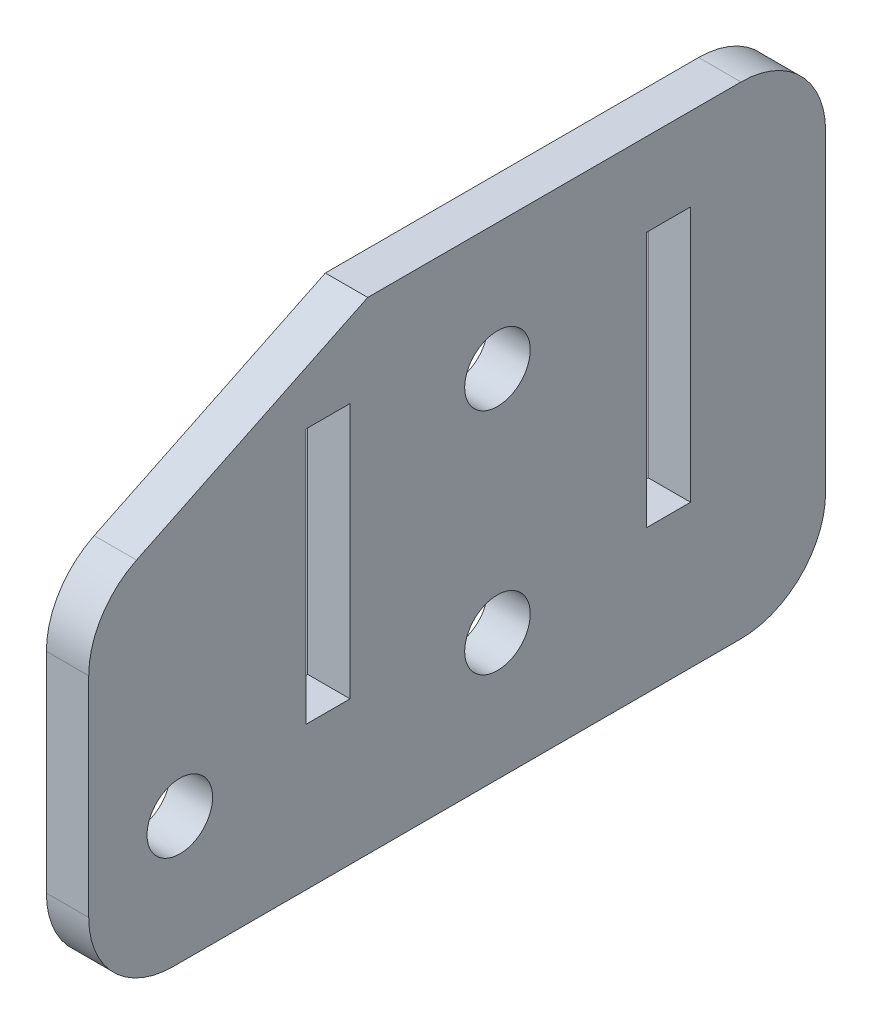
ISO-10303-21;
HEADER;
FILE_DESCRIPTION(('STEP AP214'),'2;1');
FILE_NAME('part.step','',(''),(''),'','','');
FILE_SCHEMA(('AUTOMOTIVE_DESIGN { 1 0 10303 214 1 1 1 1 }'));
ENDSEC;
DATA;
#1=APPLICATION_CONTEXT('core data for automotive mechanical design processes');
#2=APPLICATION_PROTOCOL_DEFINITION('international standard','automotive_design',2000,#1);
#3=PRODUCT_CONTEXT('',#1,'mechanical');
#4=PRODUCT('Part','Part','',(#3));
#5=PRODUCT_RELATED_PRODUCT_CATEGORY('part','',(#4));
#6=PRODUCT_DEFINITION_FORMATION('','',#4);
#7=PRODUCT_DEFINITION_CONTEXT('part definition',#1,'design');
#8=PRODUCT_DEFINITION('design','',#6,#7);
#9=PRODUCT_DEFINITION_SHAPE('','',#8);
#10=(LENGTH_UNIT() NAMED_UNIT(*) SI_UNIT(.MILLI.,.METRE.));
#11=(NAMED_UNIT(*) PLANE_ANGLE_UNIT() SI_UNIT($,.RADIAN.));
#12=(NAMED_UNIT(*) SI_UNIT($,.STERADIAN.) SOLID_ANGLE_UNIT());
#13=UNCERTAINTY_MEASURE_WITH_UNIT(LENGTH_MEASURE(1.E-05),#10,'distance_accuracy_value','');
#14=(GEOMETRIC_REPRESENTATION_CONTEXT(3) GLOBAL_UNCERTAINTY_ASSIGNED_CONTEXT((#13)) GLOBAL_UNIT_ASSIGNED_CONTEXT((#10,
#11,#12)) REPRESENTATION_CONTEXT('',''));
#15=CARTESIAN_POINT('',(0.,0.,0.));
#16=DIRECTION('',(0.,0.,1.));
#17=DIRECTION('',(1.,0.,0.));
#18=AXIS2_PLACEMENT_3D('',#15,#16,#17);
#19=CARTESIAN_POINT('',(3.175,0.,0.));
#20=DIRECTION('',(0.,1.,0.));
#21=DIRECTION('',(0.,0.,1.));
#22=AXIS2_PLACEMENT_3D('',#19,#20,#21);
#23=PLANE('',#22);
#24=DIRECTION('',(0.,0.,-1.));
#25=VECTOR('',#24,1.);
#26=CARTESIAN_POINT('',(3.175,0.,0.));
#27=LINE('',#26,#25);
#28=CARTESIAN_POINT('',(3.175,0.,-6.35));
#29=VERTEX_POINT('',#28);
#30=CARTESIAN_POINT('',(3.175,0.,-48.895));
#31=VERTEX_POINT('',#30);
#32=EDGE_CURVE('E271',#29,#31,#27,.T.);
#33=ORIENTED_EDGE('',*,*,#32,.F.);
#34=DIRECTION('',(-1.,0.,0.));
#35=VECTOR('',#34,1.);
#36=CARTESIAN_POINT('',(3.175,0.,-6.35));
#37=LINE('',#36,#35);
#38=CARTESIAN_POINT('',(0.,0.,-6.35));
#39=VERTEX_POINT('',#38);
#40=EDGE_CURVE('E346',#29,#39,#37,.T.);
#41=ORIENTED_EDGE('',*,*,#40,.T.);
#42=DIRECTION('',(0.,0.,-1.));
#43=VECTOR('',#42,1.);
#44=CARTESIAN_POINT('',(0.,0.,0.));
#45=LINE('',#44,#43);
#46=CARTESIAN_POINT('',(0.,0.,-48.895));
#47=VERTEX_POINT('',#46);
#48=EDGE_CURVE('E222',#39,#47,#45,.T.);
#49=ORIENTED_EDGE('',*,*,#48,.T.);
#50=DIRECTION('',(-1.,0.,0.));
#51=VECTOR('',#50,1.);
#52=CARTESIAN_POINT('',(3.175,0.,-48.895));
#53=LINE('',#52,#51);
#54=EDGE_CURVE('E343',#47,#31,#53,.F.);
#55=ORIENTED_EDGE('',*,*,#54,.T.);
#56=EDGE_LOOP('',(#33,#41,#49,#55));
#57=FACE_BOUND('',#56,.T.);
#58=ADVANCED_FACE('F47',(#57),#23,.F.);
#59=CARTESIAN_POINT('',(3.175,0.,-55.245));
#60=DIRECTION('',(0.,0.,1.));
#61=DIRECTION('',(1.,0.,0.));
#62=AXIS2_PLACEMENT_3D('',#59,#60,#61);
#63=PLANE('',#62);
#64=DIRECTION('',(0.,1.,0.));
#65=VECTOR('',#64,1.);
#66=CARTESIAN_POINT('',(0.,0.,-55.245));
#67=LINE('',#66,#65);
#68=CARTESIAN_POINT('',(0.,6.35,-55.245));
#69=VERTEX_POINT('',#68);
#70=CARTESIAN_POINT('',(0.,29.80436,-55.245));
#71=VERTEX_POINT('',#70);
#72=EDGE_CURVE('E294',#69,#71,#67,.T.);
#73=ORIENTED_EDGE('',*,*,#72,.T.);
#74=DIRECTION('',(-1.,0.,0.));
#75=VECTOR('',#74,1.);
#76=CARTESIAN_POINT('',(3.175,29.80436,-55.245));
#77=LINE('',#76,#75);
#78=CARTESIAN_POINT('',(3.175,29.80436,-55.245));
#79=VERTEX_POINT('',#78);
#80=EDGE_CURVE('E11',#71,#79,#77,.F.);
#81=ORIENTED_EDGE('',*,*,#80,.T.);
#82=DIRECTION('',(0.,1.,0.));
#83=VECTOR('',#82,1.);
#84=CARTESIAN_POINT('',(3.175,0.,-55.245));
#85=LINE('',#84,#83);
#86=CARTESIAN_POINT('',(3.175,6.35,-55.245));
#87=VERTEX_POINT('',#86);
#88=EDGE_CURVE('E275',#87,#79,#85,.T.);
#89=ORIENTED_EDGE('',*,*,#88,.F.);
#90=DIRECTION('',(-1.,0.,0.));
#91=VECTOR('',#90,1.);
#92=CARTESIAN_POINT('',(3.175,6.35,-55.245));
#93=LINE('',#92,#91);
#94=EDGE_CURVE('E57',#87,#69,#93,.T.);
#95=ORIENTED_EDGE('',*,*,#94,.T.);
#96=EDGE_LOOP('',(#73,#81,#89,#95));
#97=FACE_BOUND('',#96,.T.);
#98=ADVANCED_FACE('F358',(#97),#63,.F.);
#99=CARTESIAN_POINT('',(3.175,36.15436,-55.245));
#100=DIRECTION('',(0.,-1.,0.));
#101=DIRECTION('',(0.,0.,-1.));
#102=AXIS2_PLACEMENT_3D('',#99,#100,#101);
#103=PLANE('',#102);
#104=DIRECTION('',(0.,0.,1.));
#105=VECTOR('',#104,1.);
#106=CARTESIAN_POINT('',(3.175,36.15436,-55.245));
#107=LINE('',#106,#105);
#108=CARTESIAN_POINT('',(3.175,36.15436,-48.895));
#109=VERTEX_POINT('',#108);
#110=CARTESIAN_POINT('',(3.175,36.15436,-20.9147283));
#111=VERTEX_POINT('',#110);
#112=EDGE_CURVE('E279',#109,#111,#107,.T.);
#113=ORIENTED_EDGE('',*,*,#112,.F.);
#114=DIRECTION('',(-1.,0.,0.));
#115=VECTOR('',#114,1.);
#116=CARTESIAN_POINT('',(3.175,36.15436,-48.895));
#117=LINE('',#116,#115);
#118=CARTESIAN_POINT('',(0.,36.15436,-48.895));
#119=VERTEX_POINT('',#118);
#120=EDGE_CURVE('E350',#109,#119,#117,.T.);
#121=ORIENTED_EDGE('',*,*,#120,.T.);
#122=DIRECTION('',(0.,0.,1.));
#123=VECTOR('',#122,1.);
#124=CARTESIAN_POINT('',(0.,36.15436,-55.245));
#125=LINE('',#124,#123);
#126=CARTESIAN_POINT('',(0.,36.15436,-20.9147283));
#127=VERTEX_POINT('',#126);
#128=EDGE_CURVE('E297',#119,#127,#125,.T.);
#129=ORIENTED_EDGE('',*,*,#128,.T.);
#130=DIRECTION('',(-1.,0.,0.));
#131=VECTOR('',#130,1.);
#132=CARTESIAN_POINT('',(3.175,36.15436,-20.9147283));
#133=LINE('',#132,#131);
#134=EDGE_CURVE('E290',#111,#127,#133,.T.);
#135=ORIENTED_EDGE('',*,*,#134,.F.);
#136=EDGE_LOOP('',(#113,#121,#129,#135));
#137=FACE_BOUND('',#136,.T.);
#138=ADVANCED_FACE('F371',(#137),#103,.F.);
#139=CARTESIAN_POINT('',(3.175,36.15436,-20.9147283));
#140=DIRECTION('',(0.,-0.900154048389244,-0.435571680861435));
#141=DIRECTION('',(0.,0.435571680861435,-0.900154048389244));
#142=AXIS2_PLACEMENT_3D('',#139,#140,#141);
#143=PLANE('',#142);
#144=DIRECTION('',(0.,-0.435571680861435,0.900154048389244));
#145=VECTOR('',#144,1.);
#146=CARTESIAN_POINT('',(0.,36.15436,-20.9147283));
#147=LINE('',#146,#145);
#148=CARTESIAN_POINT('',(0.,27.7683262131736,-3.58411982652989));
#149=VERTEX_POINT('',#148);
#150=EDGE_CURVE('E300',#127,#149,#147,.T.);
#151=ORIENTED_EDGE('',*,*,#150,.T.);
#152=DIRECTION('',(-1.,0.,0.));
#153=VECTOR('',#152,1.);
#154=CARTESIAN_POINT('',(3.175,27.7683262131736,-3.58411982652989));
#155=LINE('',#154,#153);
#156=CARTESIAN_POINT('',(3.175,27.7683262131736,-3.58411982652989));
#157=VERTEX_POINT('',#156);
#158=EDGE_CURVE('E329',#149,#157,#155,.F.);
#159=ORIENTED_EDGE('',*,*,#158,.T.);
#160=DIRECTION('',(0.,-0.435571680861435,0.900154048389244));
#161=VECTOR('',#160,1.);
#162=CARTESIAN_POINT('',(3.175,36.15436,-20.9147283));
#163=LINE('',#162,#161);
#164=EDGE_CURVE('E282',#111,#157,#163,.T.);
#165=ORIENTED_EDGE('',*,*,#164,.F.);
#166=ORIENTED_EDGE('',*,*,#134,.T.);
#167=EDGE_LOOP('',(#151,#159,#165,#166));
#168=FACE_BOUND('',#167,.T.);
#169=ADVANCED_FACE('F492',(#168),#143,.F.);
#170=CARTESIAN_POINT('',(3.175,26.034021846,0.));
#171=DIRECTION('',(0.,0.,-1.));
#172=DIRECTION('',(-1.,0.,0.));
#173=AXIS2_PLACEMENT_3D('',#170,#171,#172);
#174=PLANE('',#173);
#175=DIRECTION('',(0.,-1.,0.));
#176=VECTOR('',#175,1.);
#177=CARTESIAN_POINT('',(3.175,26.034021846,0.));
#178=LINE('',#177,#176);
#179=CARTESIAN_POINT('',(3.175,22.0523480059019,0.));
#180=VERTEX_POINT('',#179);
#181=CARTESIAN_POINT('',(3.175,6.35,0.));
#182=VERTEX_POINT('',#181);
#183=EDGE_CURVE('E286',#180,#182,#178,.T.);
#184=ORIENTED_EDGE('',*,*,#183,.F.);
#185=DIRECTION('',(-1.,0.,0.));
#186=VECTOR('',#185,1.);
#187=CARTESIAN_POINT('',(3.175,22.0523480059019,0.));
#188=LINE('',#187,#186);
#189=CARTESIAN_POINT('',(0.,22.0523480059019,0.));
#190=VERTEX_POINT('',#189);
#191=EDGE_CURVE('E313',#180,#190,#188,.T.);
#192=ORIENTED_EDGE('',*,*,#191,.T.);
#193=DIRECTION('',(0.,-1.,0.));
#194=VECTOR('',#193,1.);
#195=CARTESIAN_POINT('',(0.,26.034021846,0.));
#196=LINE('',#195,#194);
#197=CARTESIAN_POINT('',(0.,6.35,0.));
#198=VERTEX_POINT('',#197);
#199=EDGE_CURVE('E276',#190,#198,#196,.T.);
#200=ORIENTED_EDGE('',*,*,#199,.T.);
#201=DIRECTION('',(-1.,0.,0.));
#202=VECTOR('',#201,1.);
#203=CARTESIAN_POINT('',(3.175,6.35,0.));
#204=LINE('',#203,#202);
#205=EDGE_CURVE('E310',#198,#182,#204,.F.);
#206=ORIENTED_EDGE('',*,*,#205,.T.);
#207=EDGE_LOOP('',(#184,#192,#200,#206));
#208=FACE_BOUND('',#207,.T.);
#209=ADVANCED_FACE('F382',(#208),#174,.F.);
#210=CARTESIAN_POINT('',(3.175,0.,0.));
#211=DIRECTION('',(1.,0.,0.));
#212=DIRECTION('',(0.,0.,-1.));
#213=AXIS2_PLACEMENT_3D('',#210,#211,#212);
#214=PLANE('',#213);
#215=CARTESIAN_POINT('',(3.175,9.525,-30.642153092));
#216=DIRECTION('',(1.,0.,0.));
#217=DIRECTION('',(0.,0.,-1.));
#218=AXIS2_PLACEMENT_3D('',#215,#216,#217);
#219=CIRCLE('',#218,2.45744999999999);
#220=CARTESIAN_POINT('',(3.175,9.525,-33.099603092));
#221=VERTEX_POINT('',#220);
#222=EDGE_CURVE('E619',#221,#221,#219,.T.);
#223=ORIENTED_EDGE('',*,*,#222,.F.);
#224=EDGE_LOOP('',(#223));
#225=FACE_BOUND('',#224,.T.);
#226=CARTESIAN_POINT('',(3.175,26.67,-30.642153092));
#227=DIRECTION('',(1.,0.,0.));
#228=DIRECTION('',(0.,0.,-1.));
#229=AXIS2_PLACEMENT_3D('',#226,#227,#228);
#230=CIRCLE('',#229,2.45744999999999);
#231=CARTESIAN_POINT('',(3.175,26.67,-33.099603092));
#232=VERTEX_POINT('',#231);
#233=EDGE_CURVE('E612',#232,#232,#230,.T.);
#234=ORIENTED_EDGE('',*,*,#233,.F.);
#235=EDGE_LOOP('',(#234));
#236=FACE_BOUND('',#235,.T.);
#237=CARTESIAN_POINT('',(3.175,9.525,-6.829653092));
#238=DIRECTION('',(1.,0.,0.));
#239=DIRECTION('',(0.,0.,-1.));
#240=AXIS2_PLACEMENT_3D('',#237,#238,#239);
#241=CIRCLE('',#240,2.45744999999999);
#242=CARTESIAN_POINT('',(3.175,9.525,-9.28710309199999));
#243=VERTEX_POINT('',#242);
#244=EDGE_CURVE('E51',#243,#243,#241,.T.);
#245=ORIENTED_EDGE('',*,*,#244,.F.);
#246=EDGE_LOOP('',(#245));
#247=FACE_BOUND('',#246,.T.);
#248=DIRECTION('',(0.,-1.,0.));
#249=VECTOR('',#248,1.);
#250=CARTESIAN_POINT('',(3.175,10.75436,-45.120153092));
#251=LINE('',#250,#249);
#252=CARTESIAN_POINT('',(3.175,29.93136,-45.120153092));
#253=VERTEX_POINT('',#252);
#254=CARTESIAN_POINT('',(3.175,10.75436,-45.120153092));
#255=VERTEX_POINT('',#254);
#256=EDGE_CURVE('E172',#253,#255,#251,.T.);
#257=ORIENTED_EDGE('',*,*,#256,.T.);
#258=DIRECTION('',(0.,0.,1.));
#259=VECTOR('',#258,1.);
#260=CARTESIAN_POINT('',(3.175,10.75436,-45.120153092));
#261=LINE('',#260,#259);
#262=CARTESIAN_POINT('',(3.175,10.75436,-41.818153092));
#263=VERTEX_POINT('',#262);
#264=EDGE_CURVE('E185',#255,#263,#261,.T.);
#265=ORIENTED_EDGE('',*,*,#264,.T.);
#266=DIRECTION('',(0.,1.,0.));
#267=VECTOR('',#266,1.);
#268=CARTESIAN_POINT('',(3.175,10.75436,-41.818153092));
#269=LINE('',#268,#267);
#270=CARTESIAN_POINT('',(3.175,29.93136,-41.818153092));
#271=VERTEX_POINT('',#270);
#272=EDGE_CURVE('E190',#263,#271,#269,.T.);
#273=ORIENTED_EDGE('',*,*,#272,.T.);
#274=DIRECTION('',(0.,0.,-1.));
#275=VECTOR('',#274,1.);
#276=CARTESIAN_POINT('',(3.175,29.93136,-45.120153092));
#277=LINE('',#276,#275);
#278=EDGE_CURVE('E181',#271,#253,#277,.T.);
#279=ORIENTED_EDGE('',*,*,#278,.T.);
#280=EDGE_LOOP('',(#257,#265,#273,#279));
#281=FACE_BOUND('',#280,.T.);
#282=DIRECTION('',(0.,-1.,0.));
#283=VECTOR('',#282,1.);
#284=CARTESIAN_POINT('',(3.175,10.75436,-19.593153092));
#285=LINE('',#284,#283);
#286=CARTESIAN_POINT('',(3.175,29.93136,-19.593153092));
#287=VERTEX_POINT('',#286);
#288=CARTESIAN_POINT('',(3.175,10.75436,-19.593153092));
#289=VERTEX_POINT('',#288);
#290=EDGE_CURVE('E228',#287,#289,#285,.T.);
#291=ORIENTED_EDGE('',*,*,#290,.T.);
#292=DIRECTION('',(0.,0.,1.));
#293=VECTOR('',#292,1.);
#294=CARTESIAN_POINT('',(3.175,10.75436,-19.593153092));
#295=LINE('',#294,#293);
#296=CARTESIAN_POINT('',(3.175,10.75436,-16.291153092));
#297=VERTEX_POINT('',#296);
#298=EDGE_CURVE('E232',#289,#297,#295,.T.);
#299=ORIENTED_EDGE('',*,*,#298,.T.);
#300=DIRECTION('',(0.,1.,0.));
#301=VECTOR('',#300,1.);
#302=CARTESIAN_POINT('',(3.175,10.75436,-16.291153092));
#303=LINE('',#302,#301);
#304=CARTESIAN_POINT('',(3.175,29.93136,-16.291153092));
#305=VERTEX_POINT('',#304);
#306=EDGE_CURVE('E237',#297,#305,#303,.T.);
#307=ORIENTED_EDGE('',*,*,#306,.T.);
#308=DIRECTION('',(0.,0.,-1.));
#309=VECTOR('',#308,1.);
#310=CARTESIAN_POINT('',(3.175,29.93136,-19.593153092));
#311=LINE('',#310,#309);
#312=EDGE_CURVE('E241',#305,#287,#311,.T.);
#313=ORIENTED_EDGE('',*,*,#312,.T.);
#314=EDGE_LOOP('',(#291,#299,#307,#313));
#315=FACE_BOUND('',#314,.T.);
#316=ORIENTED_EDGE('',*,*,#164,.T.);
#317=CARTESIAN_POINT('',(3.175,22.0523480059019,-6.35));
#318=DIRECTION('',(1.,0.,0.));
#319=DIRECTION('',(0.,0.,-1.));
#320=AXIS2_PLACEMENT_3D('',#317,#318,#319);
#321=CIRCLE('',#320,6.35);
#322=EDGE_CURVE('E340',#157,#180,#321,.T.);
#323=ORIENTED_EDGE('',*,*,#322,.T.);
#324=ORIENTED_EDGE('',*,*,#183,.T.);
#325=CARTESIAN_POINT('',(3.175,6.35,-6.35));
#326=DIRECTION('',(1.,0.,0.));
#327=DIRECTION('',(0.,0.,-1.));
#328=AXIS2_PLACEMENT_3D('',#325,#326,#327);
#329=CIRCLE('',#328,6.35);
#330=EDGE_CURVE('E337',#182,#29,#329,.T.);
#331=ORIENTED_EDGE('',*,*,#330,.T.);
#332=ORIENTED_EDGE('',*,*,#32,.T.);
#333=CARTESIAN_POINT('',(3.175,6.35,-48.895));
#334=DIRECTION('',(1.,0.,0.));
#335=DIRECTION('',(0.,0.,-1.));
#336=AXIS2_PLACEMENT_3D('',#333,#334,#335);
#337=CIRCLE('',#336,6.35);
#338=EDGE_CURVE('E332',#31,#87,#337,.T.);
#339=ORIENTED_EDGE('',*,*,#338,.T.);
#340=ORIENTED_EDGE('',*,*,#88,.T.);
#341=CARTESIAN_POINT('',(3.175,29.80436,-48.895));
#342=DIRECTION('',(1.,0.,0.));
#343=DIRECTION('',(0.,0.,-1.));
#344=AXIS2_PLACEMENT_3D('',#341,#342,#343);
#345=CIRCLE('',#344,6.35);
#346=EDGE_CURVE('E64',#79,#109,#345,.T.);
#347=ORIENTED_EDGE('',*,*,#346,.T.);
#348=ORIENTED_EDGE('',*,*,#112,.T.);
#349=EDGE_LOOP('',(#316,#323,#324,#331,#332,#339,#340,#347,#348));
#350=FACE_BOUND('',#349,.T.);
#351=ADVANCED_FACE('F192',(#225,#236,#247,#281,#315,#350),#214,.T.);
#352=CARTESIAN_POINT('',(0.,0.,0.));
#353=DIRECTION('',(1.,0.,0.));
#354=DIRECTION('',(0.,0.,-1.));
#355=AXIS2_PLACEMENT_3D('',#352,#353,#354);
#356=PLANE('',#355);
#357=CARTESIAN_POINT('',(0.,9.525,-30.642153092));
#358=DIRECTION('',(-1.,0.,0.));
#359=DIRECTION('',(0.,0.,1.));
#360=AXIS2_PLACEMENT_3D('',#357,#358,#359);
#361=CIRCLE('',#360,2.45744999999999);
#362=CARTESIAN_POINT('',(0.,9.525,-28.184703092));
#363=VERTEX_POINT('',#362);
#364=EDGE_CURVE('E591',#363,#363,#361,.T.);
#365=ORIENTED_EDGE('',*,*,#364,.F.);
#366=EDGE_LOOP('',(#365));
#367=FACE_BOUND('',#366,.T.);
#368=CARTESIAN_POINT('',(0.,26.67,-30.642153092));
#369=DIRECTION('',(-1.,0.,0.));
#370=DIRECTION('',(0.,0.,1.));
#371=AXIS2_PLACEMENT_3D('',#368,#369,#370);
#372=CIRCLE('',#371,2.45744999999999);
#373=CARTESIAN_POINT('',(0.,26.67,-28.184703092));
#374=VERTEX_POINT('',#373);
#375=EDGE_CURVE('E595',#374,#374,#372,.T.);
#376=ORIENTED_EDGE('',*,*,#375,.F.);
#377=EDGE_LOOP('',(#376));
#378=FACE_BOUND('',#377,.T.);
#379=CARTESIAN_POINT('',(0.,9.525,-6.829653092));
#380=DIRECTION('',(-1.,0.,0.));
#381=DIRECTION('',(0.,0.,1.));
#382=AXIS2_PLACEMENT_3D('',#379,#380,#381);
#383=CIRCLE('',#382,2.45744999999999);
#384=CARTESIAN_POINT('',(0.,9.525,-4.37220309200001));
#385=VERTEX_POINT('',#384);
#386=EDGE_CURVE('E203',#385,#385,#383,.T.);
#387=ORIENTED_EDGE('',*,*,#386,.F.);
#388=EDGE_LOOP('',(#387));
#389=FACE_BOUND('',#388,.T.);
#390=DIRECTION('',(0.,0.,1.));
#391=VECTOR('',#390,1.);
#392=CARTESIAN_POINT('',(0.,10.75436,-45.120153092));
#393=LINE('',#392,#391);
#394=CARTESIAN_POINT('',(0.,10.75436,-45.120153092));
#395=VERTEX_POINT('',#394);
#396=CARTESIAN_POINT('',(0.,10.75436,-41.818153092));
#397=VERTEX_POINT('',#396);
#398=EDGE_CURVE('E212',#395,#397,#393,.T.);
#399=ORIENTED_EDGE('',*,*,#398,.F.);
#400=DIRECTION('',(0.,-1.,0.));
#401=VECTOR('',#400,1.);
#402=CARTESIAN_POINT('',(0.,10.75436,-45.120153092));
#403=LINE('',#402,#401);
#404=CARTESIAN_POINT('',(0.,29.93136,-45.120153092));
#405=VERTEX_POINT('',#404);
#406=EDGE_CURVE('E175',#405,#395,#403,.T.);
#407=ORIENTED_EDGE('',*,*,#406,.F.);
#408=DIRECTION('',(0.,0.,-1.));
#409=VECTOR('',#408,1.);
#410=CARTESIAN_POINT('',(0.,29.93136,-45.120153092));
#411=LINE('',#410,#409);
#412=CARTESIAN_POINT('',(0.,29.93136,-41.818153092));
#413=VERTEX_POINT('',#412);
#414=EDGE_CURVE('E196',#413,#405,#411,.T.);
#415=ORIENTED_EDGE('',*,*,#414,.F.);
#416=DIRECTION('',(0.,1.,0.));
#417=VECTOR('',#416,1.);
#418=CARTESIAN_POINT('',(0.,10.75436,-41.818153092));
#419=LINE('',#418,#417);
#420=EDGE_CURVE('E200',#397,#413,#419,.T.);
#421=ORIENTED_EDGE('',*,*,#420,.F.);
#422=EDGE_LOOP('',(#399,#407,#415,#421));
#423=FACE_BOUND('',#422,.T.);
#424=DIRECTION('',(0.,0.,1.));
#425=VECTOR('',#424,1.);
#426=CARTESIAN_POINT('',(0.,10.75436,-19.593153092));
#427=LINE('',#426,#425);
#428=CARTESIAN_POINT('',(0.,10.75436,-19.593153092));
#429=VERTEX_POINT('',#428);
#430=CARTESIAN_POINT('',(0.,10.75436,-16.291153092));
#431=VERTEX_POINT('',#430);
#432=EDGE_CURVE('E249',#429,#431,#427,.T.);
#433=ORIENTED_EDGE('',*,*,#432,.F.);
#434=DIRECTION('',(0.,-1.,0.));
#435=VECTOR('',#434,1.);
#436=CARTESIAN_POINT('',(0.,10.75436,-19.593153092));
#437=LINE('',#436,#435);
#438=CARTESIAN_POINT('',(0.,29.93136,-19.593153092));
#439=VERTEX_POINT('',#438);
#440=EDGE_CURVE('E246',#439,#429,#437,.T.);
#441=ORIENTED_EDGE('',*,*,#440,.F.);
#442=DIRECTION('',(0.,0.,-1.));
#443=VECTOR('',#442,1.);
#444=CARTESIAN_POINT('',(0.,29.93136,-19.593153092));
#445=LINE('',#444,#443);
#446=CARTESIAN_POINT('',(0.,29.93136,-16.291153092));
#447=VERTEX_POINT('',#446);
#448=EDGE_CURVE('E233',#447,#439,#445,.T.);
#449=ORIENTED_EDGE('',*,*,#448,.F.);
#450=DIRECTION('',(0.,1.,0.));
#451=VECTOR('',#450,1.);
#452=CARTESIAN_POINT('',(0.,10.75436,-16.291153092));
#453=LINE('',#452,#451);
#454=EDGE_CURVE('E253',#431,#447,#453,.T.);
#455=ORIENTED_EDGE('',*,*,#454,.F.);
#456=EDGE_LOOP('',(#433,#441,#449,#455));
#457=FACE_BOUND('',#456,.T.);
#458=ORIENTED_EDGE('',*,*,#199,.F.);
#459=CARTESIAN_POINT('',(0.,22.0523480059019,-6.35));
#460=DIRECTION('',(1.,0.,0.));
#461=DIRECTION('',(0.,0.,-1.));
#462=AXIS2_PLACEMENT_3D('',#459,#460,#461);
#463=CIRCLE('',#462,6.35);
#464=EDGE_CURVE('E326',#190,#149,#463,.F.);
#465=ORIENTED_EDGE('',*,*,#464,.T.);
#466=ORIENTED_EDGE('',*,*,#150,.F.);
#467=ORIENTED_EDGE('',*,*,#128,.F.);
#468=CARTESIAN_POINT('',(0.,29.80436,-48.895));
#469=DIRECTION('',(1.,0.,0.));
#470=DIRECTION('',(0.,0.,-1.));
#471=AXIS2_PLACEMENT_3D('',#468,#469,#470);
#472=CIRCLE('',#471,6.35);
#473=EDGE_CURVE('E320',#119,#71,#472,.F.);
#474=ORIENTED_EDGE('',*,*,#473,.T.);
#475=ORIENTED_EDGE('',*,*,#72,.F.);
#476=CARTESIAN_POINT('',(0.,6.35,-48.895));
#477=DIRECTION('',(1.,0.,0.));
#478=DIRECTION('',(0.,0.,-1.));
#479=AXIS2_PLACEMENT_3D('',#476,#477,#478);
#480=CIRCLE('',#479,6.35);
#481=EDGE_CURVE('E317',#69,#47,#480,.F.);
#482=ORIENTED_EDGE('',*,*,#481,.T.);
#483=ORIENTED_EDGE('',*,*,#48,.F.);
#484=CARTESIAN_POINT('',(0.,6.35,-6.35));
#485=DIRECTION('',(1.,0.,0.));
#486=DIRECTION('',(0.,0.,-1.));
#487=AXIS2_PLACEMENT_3D('',#484,#485,#486);
#488=CIRCLE('',#487,6.35);
#489=EDGE_CURVE('E323',#39,#198,#488,.F.);
#490=ORIENTED_EDGE('',*,*,#489,.T.);
#491=EDGE_LOOP('',(#458,#465,#466,#467,#474,#475,#482,#483,#490));
#492=FACE_BOUND('',#491,.T.);
#493=ADVANCED_FACE('F363',(#367,#378,#389,#423,#457,#492),#356,.F.);
#494=CARTESIAN_POINT('',(3.175,10.75436,-19.593153092));
#495=DIRECTION('',(0.,0.,-1.));
#496=DIRECTION('',(-1.,0.,0.));
#497=AXIS2_PLACEMENT_3D('',#494,#495,#496);
#498=PLANE('',#497);
#499=ORIENTED_EDGE('',*,*,#440,.T.);
#500=DIRECTION('',(-1.,0.,0.));
#501=VECTOR('',#500,1.);
#502=CARTESIAN_POINT('',(3.175,10.75436,-19.593153092));
#503=LINE('',#502,#501);
#504=EDGE_CURVE('E245',#289,#429,#503,.T.);
#505=ORIENTED_EDGE('',*,*,#504,.F.);
#506=ORIENTED_EDGE('',*,*,#290,.F.);
#507=DIRECTION('',(-1.,0.,0.));
#508=VECTOR('',#507,1.);
#509=CARTESIAN_POINT('',(3.175,29.93136,-19.593153092));
#510=LINE('',#509,#508);
#511=EDGE_CURVE('E213',#287,#439,#510,.T.);
#512=ORIENTED_EDGE('',*,*,#511,.T.);
#513=EDGE_LOOP('',(#499,#505,#506,#512));
#514=FACE_BOUND('',#513,.T.);
#515=ADVANCED_FACE('F476',(#514),#498,.F.);
#516=CARTESIAN_POINT('',(3.175,29.93136,-19.593153092));
#517=DIRECTION('',(0.,1.,0.));
#518=DIRECTION('',(0.,0.,1.));
#519=AXIS2_PLACEMENT_3D('',#516,#517,#518);
#520=PLANE('',#519);
#521=ORIENTED_EDGE('',*,*,#448,.T.);
#522=ORIENTED_EDGE('',*,*,#511,.F.);
#523=ORIENTED_EDGE('',*,*,#312,.F.);
#524=DIRECTION('',(-1.,0.,0.));
#525=VECTOR('',#524,1.);
#526=CARTESIAN_POINT('',(3.175,29.93136,-16.291153092));
#527=LINE('',#526,#525);
#528=EDGE_CURVE('E262',#305,#447,#527,.T.);
#529=ORIENTED_EDGE('',*,*,#528,.T.);
#530=EDGE_LOOP('',(#521,#522,#523,#529));
#531=FACE_BOUND('',#530,.T.);
#532=ADVANCED_FACE('F472',(#531),#520,.F.);
#533=CARTESIAN_POINT('',(3.175,10.75436,-16.291153092));
#534=DIRECTION('',(0.,0.,1.));
#535=DIRECTION('',(1.,0.,0.));
#536=AXIS2_PLACEMENT_3D('',#533,#534,#535);
#537=PLANE('',#536);
#538=ORIENTED_EDGE('',*,*,#454,.T.);
#539=ORIENTED_EDGE('',*,*,#528,.F.);
#540=ORIENTED_EDGE('',*,*,#306,.F.);
#541=DIRECTION('',(-1.,0.,0.));
#542=VECTOR('',#541,1.);
#543=CARTESIAN_POINT('',(3.175,10.75436,-16.291153092));
#544=LINE('',#543,#542);
#545=EDGE_CURVE('E265',#297,#431,#544,.T.);
#546=ORIENTED_EDGE('',*,*,#545,.T.);
#547=EDGE_LOOP('',(#538,#539,#540,#546));
#548=FACE_BOUND('',#547,.T.);
#549=ADVANCED_FACE('F475',(#548),#537,.F.);
#550=CARTESIAN_POINT('',(3.175,10.75436,-19.593153092));
#551=DIRECTION('',(0.,-1.,0.));
#552=DIRECTION('',(0.,0.,-1.));
#553=AXIS2_PLACEMENT_3D('',#550,#551,#552);
#554=PLANE('',#553);
#555=ORIENTED_EDGE('',*,*,#432,.T.);
#556=ORIENTED_EDGE('',*,*,#545,.F.);
#557=ORIENTED_EDGE('',*,*,#298,.F.);
#558=ORIENTED_EDGE('',*,*,#504,.T.);
#559=EDGE_LOOP('',(#555,#556,#557,#558));
#560=FACE_BOUND('',#559,.T.);
#561=ADVANCED_FACE('F471',(#560),#554,.F.);
#562=CARTESIAN_POINT('',(3.175,10.75436,-45.120153092));
#563=DIRECTION('',(0.,0.,-1.));
#564=DIRECTION('',(-1.,0.,0.));
#565=AXIS2_PLACEMENT_3D('',#562,#563,#564);
#566=PLANE('',#565);
#567=ORIENTED_EDGE('',*,*,#406,.T.);
#568=DIRECTION('',(-1.,0.,0.));
#569=VECTOR('',#568,1.);
#570=CARTESIAN_POINT('',(3.175,10.75436,-45.120153092));
#571=LINE('',#570,#569);
#572=EDGE_CURVE('E168',#255,#395,#571,.T.);
#573=ORIENTED_EDGE('',*,*,#572,.F.);
#574=ORIENTED_EDGE('',*,*,#256,.F.);
#575=DIRECTION('',(-1.,0.,0.));
#576=VECTOR('',#575,1.);
#577=CARTESIAN_POINT('',(3.175,29.93136,-45.120153092));
#578=LINE('',#577,#576);
#579=EDGE_CURVE('E219',#253,#405,#578,.T.);
#580=ORIENTED_EDGE('',*,*,#579,.T.);
#581=EDGE_LOOP('',(#567,#573,#574,#580));
#582=FACE_BOUND('',#581,.T.);
#583=ADVANCED_FACE('F170',(#582),#566,.F.);
#584=CARTESIAN_POINT('',(3.175,29.93136,-45.120153092));
#585=DIRECTION('',(0.,1.,0.));
#586=DIRECTION('',(0.,0.,1.));
#587=AXIS2_PLACEMENT_3D('',#584,#585,#586);
#588=PLANE('',#587);
#589=ORIENTED_EDGE('',*,*,#414,.T.);
#590=ORIENTED_EDGE('',*,*,#579,.F.);
#591=ORIENTED_EDGE('',*,*,#278,.F.);
#592=DIRECTION('',(-1.,0.,0.));
#593=VECTOR('',#592,1.);
#594=CARTESIAN_POINT('',(3.175,29.93136,-41.818153092));
#595=LINE('',#594,#593);
#596=EDGE_CURVE('E223',#271,#413,#595,.T.);
#597=ORIENTED_EDGE('',*,*,#596,.T.);
#598=EDGE_LOOP('',(#589,#590,#591,#597));
#599=FACE_BOUND('',#598,.T.);
#600=ADVANCED_FACE('F460',(#599),#588,.F.);
#601=CARTESIAN_POINT('',(3.175,10.75436,-41.818153092));
#602=DIRECTION('',(0.,0.,1.));
#603=DIRECTION('',(1.,0.,0.));
#604=AXIS2_PLACEMENT_3D('',#601,#602,#603);
#605=PLANE('',#604);
#606=ORIENTED_EDGE('',*,*,#420,.T.);
#607=ORIENTED_EDGE('',*,*,#596,.F.);
#608=ORIENTED_EDGE('',*,*,#272,.F.);
#609=DIRECTION('',(-1.,0.,0.));
#610=VECTOR('',#609,1.);
#611=CARTESIAN_POINT('',(3.175,10.75436,-41.818153092));
#612=LINE('',#611,#610);
#613=EDGE_CURVE('E180',#263,#397,#612,.T.);
#614=ORIENTED_EDGE('',*,*,#613,.T.);
#615=EDGE_LOOP('',(#606,#607,#608,#614));
#616=FACE_BOUND('',#615,.T.);
#617=ADVANCED_FACE('F463',(#616),#605,.F.);
#618=CARTESIAN_POINT('',(3.175,10.75436,-45.120153092));
#619=DIRECTION('',(0.,-1.,0.));
#620=DIRECTION('',(0.,0.,-1.));
#621=AXIS2_PLACEMENT_3D('',#618,#619,#620);
#622=PLANE('',#621);
#623=ORIENTED_EDGE('',*,*,#398,.T.);
#624=ORIENTED_EDGE('',*,*,#613,.F.);
#625=ORIENTED_EDGE('',*,*,#264,.F.);
#626=ORIENTED_EDGE('',*,*,#572,.T.);
#627=EDGE_LOOP('',(#623,#624,#625,#626));
#628=FACE_BOUND('',#627,.T.);
#629=ADVANCED_FACE('F186',(#628),#622,.F.);
#630=CARTESIAN_POINT('',(3.175,22.0523480059019,-6.35));
#631=DIRECTION('',(-1.,0.,0.));
#632=DIRECTION('',(0.,0.,1.));
#633=AXIS2_PLACEMENT_3D('',#630,#631,#632);
#634=CYLINDRICAL_SURFACE('',#633,6.35);
#635=ORIENTED_EDGE('',*,*,#322,.F.);
#636=ORIENTED_EDGE('',*,*,#158,.F.);
#637=ORIENTED_EDGE('',*,*,#464,.F.);
#638=ORIENTED_EDGE('',*,*,#191,.F.);
#639=EDGE_LOOP('',(#635,#636,#637,#638));
#640=FACE_BOUND('',#639,.T.);
#641=ADVANCED_FACE('F380',(#640),#634,.T.);
#642=CARTESIAN_POINT('',(3.175,6.35,-6.35));
#643=DIRECTION('',(-1.,0.,0.));
#644=DIRECTION('',(0.,0.,1.));
#645=AXIS2_PLACEMENT_3D('',#642,#643,#644);
#646=CYLINDRICAL_SURFACE('',#645,6.35);
#647=ORIENTED_EDGE('',*,*,#330,.F.);
#648=ORIENTED_EDGE('',*,*,#205,.F.);
#649=ORIENTED_EDGE('',*,*,#489,.F.);
#650=ORIENTED_EDGE('',*,*,#40,.F.);
#651=EDGE_LOOP('',(#647,#648,#649,#650));
#652=FACE_BOUND('',#651,.T.);
#653=ADVANCED_FACE('F387',(#652),#646,.T.);
#654=CARTESIAN_POINT('',(3.175,29.80436,-48.895));
#655=DIRECTION('',(-1.,0.,0.));
#656=DIRECTION('',(0.,0.,1.));
#657=AXIS2_PLACEMENT_3D('',#654,#655,#656);
#658=CYLINDRICAL_SURFACE('',#657,6.35);
#659=ORIENTED_EDGE('',*,*,#346,.F.);
#660=ORIENTED_EDGE('',*,*,#80,.F.);
#661=ORIENTED_EDGE('',*,*,#473,.F.);
#662=ORIENTED_EDGE('',*,*,#120,.F.);
#663=EDGE_LOOP('',(#659,#660,#661,#662));
#664=FACE_BOUND('',#663,.T.);
#665=ADVANCED_FACE('F369',(#664),#658,.T.);
#666=CARTESIAN_POINT('',(3.175,6.35,-48.895));
#667=DIRECTION('',(-1.,0.,0.));
#668=DIRECTION('',(0.,0.,1.));
#669=AXIS2_PLACEMENT_3D('',#666,#667,#668);
#670=CYLINDRICAL_SURFACE('',#669,6.35);
#671=ORIENTED_EDGE('',*,*,#338,.F.);
#672=ORIENTED_EDGE('',*,*,#54,.F.);
#673=ORIENTED_EDGE('',*,*,#481,.F.);
#674=ORIENTED_EDGE('',*,*,#94,.F.);
#675=EDGE_LOOP('',(#671,#672,#673,#674));
#676=FACE_BOUND('',#675,.T.);
#677=ADVANCED_FACE('F49',(#676),#670,.T.);
#678=CARTESIAN_POINT('',(0.,9.525,-6.829653092));
#679=DIRECTION('',(-1.,0.,0.));
#680=DIRECTION('',(0.,0.,1.));
#681=AXIS2_PLACEMENT_3D('',#678,#679,#680);
#682=CYLINDRICAL_SURFACE('',#681,2.45744999999999);
#683=ORIENTED_EDGE('',*,*,#244,.T.);
#684=EDGE_LOOP('',(#683));
#685=FACE_BOUND('',#684,.T.);
#686=ORIENTED_EDGE('',*,*,#386,.T.);
#687=EDGE_LOOP('',(#686));
#688=FACE_BOUND('',#687,.T.);
#689=ADVANCED_FACE('F392',(#685,#688),#682,.F.);
#690=CARTESIAN_POINT('',(0.,26.67,-30.642153092));
#691=DIRECTION('',(-1.,0.,0.));
#692=DIRECTION('',(0.,0.,1.));
#693=AXIS2_PLACEMENT_3D('',#690,#691,#692);
#694=CYLINDRICAL_SURFACE('',#693,2.45744999999999);
#695=ORIENTED_EDGE('',*,*,#233,.T.);
#696=EDGE_LOOP('',(#695));
#697=FACE_BOUND('',#696,.T.);
#698=ORIENTED_EDGE('',*,*,#375,.T.);
#699=EDGE_LOOP('',(#698));
#700=FACE_BOUND('',#699,.T.);
#701=ADVANCED_FACE('F398',(#697,#700),#694,.F.);
#702=CARTESIAN_POINT('',(0.,9.525,-30.642153092));
#703=DIRECTION('',(-1.,0.,0.));
#704=DIRECTION('',(0.,0.,1.));
#705=AXIS2_PLACEMENT_3D('',#702,#703,#704);
#706=CYLINDRICAL_SURFACE('',#705,2.45744999999999);
#707=ORIENTED_EDGE('',*,*,#222,.T.);
#708=EDGE_LOOP('',(#707));
#709=FACE_BOUND('',#708,.T.);
#710=ORIENTED_EDGE('',*,*,#364,.T.);
#711=EDGE_LOOP('',(#710));
#712=FACE_BOUND('',#711,.T.);
#713=ADVANCED_FACE('F444',(#709,#712),#706,.F.);
#714=CLOSED_SHELL('',(#58,#98,#138,#169,#209,#351,#493,#515,#532,#549,#561,#583,#600,#617,#629,
#641,#653,#665,#677,#689,#701,#713));
#715=MANIFOLD_SOLID_BREP('B2',#714);
#716=ADVANCED_BREP_SHAPE_REPRESENTATION('',(#18,#715),#14);
#717=SHAPE_DEFINITION_REPRESENTATION(#9,#716);
ENDSEC;
END-ISO-10303-21;
